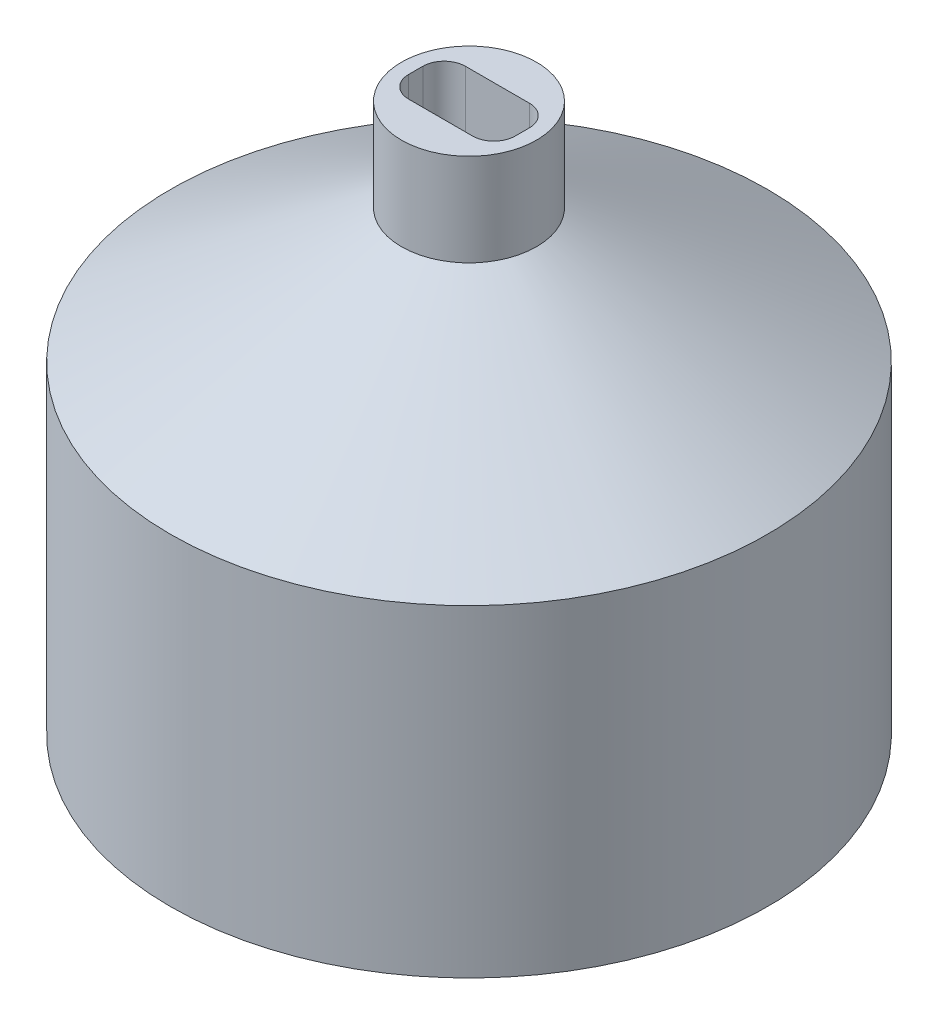
ISO-10303-21;
HEADER;
FILE_DESCRIPTION(('STEP AP214'),'2;1');
FILE_NAME('part.step','',(''),(''),'','','');
FILE_SCHEMA(('AUTOMOTIVE_DESIGN { 1 0 10303 214 1 1 1 1 }'));
ENDSEC;
DATA;
#1=APPLICATION_CONTEXT('core data for automotive mechanical design processes');
#2=APPLICATION_PROTOCOL_DEFINITION('international standard','automotive_design',2000,#1);
#3=PRODUCT_CONTEXT('',#1,'mechanical');
#4=PRODUCT('Part','Part','',(#3));
#5=PRODUCT_RELATED_PRODUCT_CATEGORY('part','',(#4));
#6=PRODUCT_DEFINITION_FORMATION('','',#4);
#7=PRODUCT_DEFINITION_CONTEXT('part definition',#1,'design');
#8=PRODUCT_DEFINITION('design','',#6,#7);
#9=PRODUCT_DEFINITION_SHAPE('','',#8);
#10=(LENGTH_UNIT() NAMED_UNIT(*) SI_UNIT(.MILLI.,.METRE.));
#11=(NAMED_UNIT(*) PLANE_ANGLE_UNIT() SI_UNIT($,.RADIAN.));
#12=(NAMED_UNIT(*) SI_UNIT($,.STERADIAN.) SOLID_ANGLE_UNIT());
#13=UNCERTAINTY_MEASURE_WITH_UNIT(LENGTH_MEASURE(1.E-05),#10,'distance_accuracy_value','');
#14=(GEOMETRIC_REPRESENTATION_CONTEXT(3) GLOBAL_UNCERTAINTY_ASSIGNED_CONTEXT((#13)) GLOBAL_UNIT_ASSIGNED_CONTEXT((#10,
#11,#12)) REPRESENTATION_CONTEXT('',''));
#15=CARTESIAN_POINT('',(0.,0.,0.));
#16=DIRECTION('',(0.,0.,1.));
#17=DIRECTION('',(1.,0.,0.));
#18=AXIS2_PLACEMENT_3D('',#15,#16,#17);
#19=CARTESIAN_POINT('',(0.,3.04641016151377,0.));
#20=DIRECTION('',(0.,-1.,0.));
#21=DIRECTION('',(0.,0.,-1.));
#22=AXIS2_PLACEMENT_3D('',#19,#20,#21);
#23=CONICAL_SURFACE('',#22,4.98371685740844,1.0471975511966);
#24=CARTESIAN_POINT('',(0.,3.04641016151377,0.));
#25=DIRECTION('',(0.,1.,0.));
#26=DIRECTION('',(0.,0.,1.));
#27=AXIS2_PLACEMENT_3D('',#24,#25,#26);
#28=CIRCLE('',#27,4.98371685740844);
#29=CARTESIAN_POINT('',(0.,3.04641016151377,4.98371685740844));
#30=VERTEX_POINT('',#29);
#31=EDGE_CURVE('E190',#30,#30,#28,.T.);
#32=ORIENTED_EDGE('',*,*,#31,.F.);
#33=EDGE_LOOP('',(#32));
#34=FACE_BOUND('',#33,.T.);
#35=CARTESIAN_POINT('',(-1.5,3.40725236660195,-4.09248561513208));
#36=CARTESIAN_POINT('',(-1.5,3.45681365681096,-4.00105307469478));
#37=CARTESIAN_POINT('',(-1.5,3.50622777759553,-3.90954045776532));
#38=CARTESIAN_POINT('',(-1.5,3.60468777635295,-3.72631506184784));
#39=CARTESIAN_POINT('',(-1.5,3.65373364699816,-3.63460227892343));
#40=CARTESIAN_POINT('',(-1.5,3.80028081066284,-3.35896667162896));
#41=CARTESIAN_POINT('',(-1.5,3.89711454550405,-3.17468829565215));
#42=CARTESIAN_POINT('',(-1.5,4.09138426305599,-2.7982648865538));
#43=CARTESIAN_POINT('',(-1.5,4.18872364393438,-2.60606949724058));
#44=CARTESIAN_POINT('',(-1.5,4.33095397019992,-2.31595615828423));
#45=CARTESIAN_POINT('',(-1.5,4.37772735319528,-2.21896346237822));
#46=CARTESIAN_POINT('',(-1.5,4.46956014939681,-2.02417224377235));
#47=CARTESIAN_POINT('',(-1.5,4.51461964685899,-1.92637376097395));
#48=CARTESIAN_POINT('',(-1.5,4.60438461359978,-1.72525836814714));
#49=CARTESIAN_POINT('',(-1.5,4.64898115070767,-1.6218924880906));
#50=CARTESIAN_POINT('',(-1.5,4.73451596061967,-1.41360403284423));
#51=CARTESIAN_POINT('',(-1.5,4.77545317241379,-1.3086810163837));
#52=CARTESIAN_POINT('',(-1.5,4.85158996042933,-1.09788593321407));
#53=CARTESIAN_POINT('',(-1.5,4.88684109122856,-0.992032794673912));
#54=CARTESIAN_POINT('',(-1.5,4.94961560908893,-0.778034214722909));
#55=CARTESIAN_POINT('',(-1.5,4.9771431503034,-0.669890039346949));
#56=CARTESIAN_POINT('',(-1.5,5.01575932094634,-0.478805310092273));
#57=CARTESIAN_POINT('',(-1.5,5.02924040925197,-0.396358013950361));
#58=CARTESIAN_POINT('',(-1.5,5.04881079835382,-0.230593804547215));
#59=CARTESIAN_POINT('',(-1.5,5.05490318814466,-0.147277269392752));
#60=CARTESIAN_POINT('',(-1.5,5.05899618388578,0.0194867329141428));
#61=CARTESIAN_POINT('',(-1.5,5.0570041958867,0.102934010257612));
#62=CARTESIAN_POINT('',(-1.5,5.04518692754269,0.269259069963903));
#63=CARTESIAN_POINT('',(-1.5,5.03536029327373,0.352136751396434));
#64=CARTESIAN_POINT('',(-1.5,4.99646368613497,0.594356523206449));
#65=CARTESIAN_POINT('',(-1.5,4.95798620922881,0.752176607806049));
#66=CARTESIAN_POINT('',(-1.5,4.88836027436955,0.985193727325204));
#67=CARTESIAN_POINT('',(-1.5,4.86311885460038,1.06236256071798));
#68=CARTESIAN_POINT('',(-1.5,4.80959744206808,1.21564636970752));
#69=CARTESIAN_POINT('',(-1.5,4.78131792662259,1.29176150873597));
#70=CARTESIAN_POINT('',(-1.5,4.72192818575268,1.44445365871125));
#71=CARTESIAN_POINT('',(-1.5,4.69077595285868,1.52101404737749));
#72=CARTESIAN_POINT('',(-1.5,4.62665248915713,1.67337211443988));
#73=CARTESIAN_POINT('',(-1.5,4.59368115291815,1.74916974832668));
#74=CARTESIAN_POINT('',(-1.5,4.49278504639777,1.97542798846415));
#75=CARTESIAN_POINT('',(-1.5,4.42279369981421,2.12496370044651));
#76=CARTESIAN_POINT('',(-1.5,4.2756705409007,2.43021847743613));
#77=CARTESIAN_POINT('',(-1.5,4.19835679791953,2.58584869317197));
#78=CARTESIAN_POINT('',(-1.5,4.0412983473303,2.89594709515474));
#79=CARTESIAN_POINT('',(-1.5,3.96155273516771,3.05041482169877));
#80=CARTESIAN_POINT('',(-1.5,3.80325421838808,3.35315159657888));
#81=CARTESIAN_POINT('',(-1.5,3.72475621064408,3.5014494719265));
#82=CARTESIAN_POINT('',(-1.5,3.56670428489042,3.79739004644383));
#83=CARTESIAN_POINT('',(-1.5,3.48715089521058,3.94503302747299));
#84=CARTESIAN_POINT('',(-1.5,3.40725236660198,4.09248561513209));
#85=B_SPLINE_CURVE_WITH_KNOTS('',3,(#35,#36,#37,#38,#39,#40,#41,#42,#43,#44,#45,#46,#47,#48,#49,
#50,#51,#52,#53,#54,#55,#56,#57,#58,#59,#60,#61,#62,#63,#64,#65,#66,#67,#68,#69,#70,#71,#72,#73,
#74,#75,#76,#77,#78,#79,#80,#81,#82,#83,#84),.UNSPECIFIED.,.F.,.F.,(4,2,2,2,2,2,2,2,2,2,2,2,2,2,
2,2,2,2,2,2,2,2,2,2,4),(0.,0.312003550624706,0.624013293310247,1.24851674334181,
1.89478245419964,2.21781550555301,2.54083265575705,2.87851365517179,3.21629224869064,
3.55081137640772,3.88515023569818,4.13549910739524,4.38574327957144,4.63575825631347,
4.88581644811055,5.37145709667408,5.61502443415327,5.85855356038223,6.10649545359645,
6.35445173213301,6.84968637373411,7.37098923761412,7.89248842821192,8.39586004982216,
8.89898853741362),.UNSPECIFIED.);
#86=CARTESIAN_POINT('',(-1.5,5.05007093589799,-0.2));
#87=VERTEX_POINT('',#86);
#88=CARTESIAN_POINT('',(-1.5,5.05007093589799,0.200000000000001));
#89=VERTEX_POINT('',#88);
#90=EDGE_CURVE('E131',#87,#89,#85,.T.);
#91=ORIENTED_EDGE('',*,*,#90,.T.);
#92=CARTESIAN_POINT('',(-1.5,5.05007093589799,0.2));
#93=CARTESIAN_POINT('',(-1.50003456707948,5.04763152312658,0.231890846560779));
#94=CARTESIAN_POINT('',(-1.49745926097453,5.04608225879295,0.263843057733521));
#95=CARTESIAN_POINT('',(-1.48727959824091,5.04476776575592,0.326928714253699));
#96=CARTESIAN_POINT('',(-1.47968231129586,5.04500003397049,0.358063246716631));
#97=CARTESIAN_POINT('',(-1.45964318441525,5.04724606795311,0.418682580347212));
#98=CARTESIAN_POINT('',(-1.44719880493939,5.04926076829665,0.448166507435311));
#99=CARTESIAN_POINT('',(-1.41788012910384,5.05503148628607,0.504650699522035));
#100=CARTESIAN_POINT('',(-1.40100597813592,5.05878744678427,0.531651045996247));
#101=CARTESIAN_POINT('',(-1.36325683621154,5.06799995809336,0.582629898482135));
#102=CARTESIAN_POINT('',(-1.34235730181166,5.07346707699104,0.60658828825566));
#103=CARTESIAN_POINT('',(-1.29730120689909,5.08599617910663,0.650717718245941));
#104=CARTESIAN_POINT('',(-1.27314447339592,5.09305824704605,0.670888557168907));
#105=CARTESIAN_POINT('',(-1.22141719268586,5.10893610299743,0.707674311016119));
#106=CARTESIAN_POINT('',(-1.19375652565358,5.11780478728224,0.724139399299231));
#107=CARTESIAN_POINT('',(-1.13656205941203,5.13699163263948,0.752318774434799));
#108=CARTESIAN_POINT('',(-1.10702690264802,5.14731085095137,0.764029571638947));
#109=CARTESIAN_POINT('',(-1.04794363986985,5.16887811740371,0.78226754344457));
#110=CARTESIAN_POINT('',(-1.01842881245463,5.18008371418754,0.788954560354733));
#111=CARTESIAN_POINT('',(-0.9592014631675,5.20355040049485,0.79782573481913));
#112=CARTESIAN_POINT('',(-0.929489382391253,5.21580959136907,0.800017822347127));
#113=CARTESIAN_POINT('',(-0.9,5.2285386435496,0.8));
#114=B_SPLINE_CURVE_WITH_KNOTS('',3,(#92,#93,#94,#95,#96,#97,#98,#99,#100,#101,#102,#103,#104,
#105,#106,#107,#108,#109,#110,#111,#112,#113),.UNSPECIFIED.,.F.,.F.,(4,2,2,2,2,2,2,2,2,2,4),(0.,
0.095825708326257,0.191516804670934,0.287258104098466,0.382996261545153,0.479337768698963,
0.575684394585799,0.675415945911439,0.775220568389831,0.871696853903101,0.96800278858794),.UNSPECIFIED.);
#115=CARTESIAN_POINT('',(-0.900000000000025,5.22853864354965,0.8));
#116=VERTEX_POINT('',#115);
#117=EDGE_CURVE('E60',#89,#116,#114,.T.);
#118=ORIENTED_EDGE('',*,*,#117,.T.);
#119=CARTESIAN_POINT('',(-5.65701904484735,2.62518172294833,0.8));
#120=CARTESIAN_POINT('',(-5.41583730570028,2.76303208785366,0.8));
#121=CARTESIAN_POINT('',(-5.17459988469034,2.90078597876048,0.8));
#122=CARTESIAN_POINT('',(-4.69188606535358,3.17590175434309,0.8));
#123=CARTESIAN_POINT('',(-4.45040965591886,3.31326361952272,0.8));
#124=CARTESIAN_POINT('',(-3.96698777251563,3.58745425084661,0.8));
#125=CARTESIAN_POINT('',(-3.72504211958772,3.72428270157666,0.8));
#126=CARTESIAN_POINT('',(-3.24057805918848,3.99690546689126,0.8));
#127=CARTESIAN_POINT('',(-2.9980596720969,4.13269981756717,0.8));
#128=CARTESIAN_POINT('',(-2.63305486988386,4.3350655622444,0.8));
#129=CARTESIAN_POINT('',(-2.5109934729264,4.40240233754071,0.8));
#130=CARTESIAN_POINT('',(-2.26643149043317,4.53629348737447,0.8));
#131=CARTESIAN_POINT('',(-2.14393087660767,4.60284781028872,0.8));
#132=CARTESIAN_POINT('',(-1.89825079974313,4.73474392231915,0.8));
#133=CARTESIAN_POINT('',(-1.77507123796355,4.80008552869222,0.8));
#134=CARTESIAN_POINT('',(-1.58948338098456,4.89650766838029,0.8));
#135=CARTESIAN_POINT('',(-1.52748799895941,4.92838151584923,0.8));
#136=CARTESIAN_POINT('',(-1.40312922869414,4.99140169612062,0.8));
#137=CARTESIAN_POINT('',(-1.3407658481273,5.02254804402577,0.8));
#138=CARTESIAN_POINT('',(-1.2147302896837,5.08422965407382,0.8));
#139=CARTESIAN_POINT('',(-1.15105162851695,5.11475174643583,0.8));
#140=CARTESIAN_POINT('',(-1.02300078296059,5.17429722582363,0.8));
#141=CARTESIAN_POINT('',(-0.958628655322949,5.20332073438127,0.8));
#142=CARTESIAN_POINT('',(-0.828777293877074,5.25918267697655,0.8));
#143=CARTESIAN_POINT('',(-0.76329618675146,5.28601684874409,0.8));
#144=CARTESIAN_POINT('',(-0.63103714920628,5.33619242564057,0.8));
#145=CARTESIAN_POINT('',(-0.564259674481767,5.35953503386703,0.8));
#146=CARTESIAN_POINT('',(-0.407534835612841,5.40723391643593,0.8));
#147=CARTESIAN_POINT('',(-0.316912134842828,5.42959536621175,0.8));
#148=CARTESIAN_POINT('',(-0.17944312902965,5.45108011413634,0.8));
#149=CARTESIAN_POINT('',(-0.133558149316256,5.45623534794758,0.8));
#150=CARTESIAN_POINT('',(-0.0415004069850994,5.46201241120368,0.8));
#151=CARTESIAN_POINT('',(0.00467228806991895,5.46263526758067,0.8));
#152=CARTESIAN_POINT('',(0.0968898280474593,5.45926600755496,0.8));
#153=CARTESIAN_POINT('',(0.142934489496648,5.45526907918503,0.8));
#154=CARTESIAN_POINT('',(0.234479924336253,5.44313962998056,0.8));
#155=CARTESIAN_POINT('',(0.27998039995443,5.43500494227111,0.8));
#156=CARTESIAN_POINT('',(0.370703185158556,5.41528828828947,0.8));
#157=CARTESIAN_POINT('',(0.415917754588044,5.40367154900945,0.8));
#158=CARTESIAN_POINT('',(0.483159535027013,5.38429571878052,0.8));
#159=CARTESIAN_POINT('',(0.505476723199564,5.3775120095117,0.8));
#160=CARTESIAN_POINT('',(0.54993321558886,5.36337881151703,0.8));
#161=CARTESIAN_POINT('',(0.572072508034269,5.35602928568616,0.8));
#162=CARTESIAN_POINT('',(0.6435435012613,5.33142930619159,0.8));
#163=CARTESIAN_POINT('',(0.692540396962611,5.3132059428661,0.8));
#164=CARTESIAN_POINT('',(0.789854168978579,5.27501701186561,0.8));
#165=CARTESIAN_POINT('',(0.838170857607375,5.25505097387647,0.8));
#166=CARTESIAN_POINT('',(0.982393346845589,5.19325993773514,0.8));
#167=CARTESIAN_POINT('',(1.07749582645917,5.14956993480962,0.8));
#168=CARTESIAN_POINT('',(1.2666261092654,5.05936333320221,0.8));
#169=CARTESIAN_POINT('',(1.36065044846493,5.01283963614586,0.8));
#170=CARTESIAN_POINT('',(1.54781444855055,4.91815937112571,0.8));
#171=CARTESIAN_POINT('',(1.64095451547426,4.87000360411423,0.8));
#172=CARTESIAN_POINT('',(1.8268692059304,4.7725379384569,0.8));
#173=CARTESIAN_POINT('',(1.91964268888908,4.7232258762239,0.8));
#174=CARTESIAN_POINT('',(2.10481493687462,4.6238777410992,0.8));
#175=CARTESIAN_POINT('',(2.19721365554234,4.57384158193397,0.8));
#176=CARTESIAN_POINT('',(2.47371631233216,4.42314588959215,0.8));
#177=CARTESIAN_POINT('',(2.65741586496224,4.32174557873372,0.8));
#178=CARTESIAN_POINT('',(3.07753365127388,4.08826370272569,0.8));
#179=CARTESIAN_POINT('',(3.31375585546818,3.95583079829893,0.8));
#180=CARTESIAN_POINT('',(3.78580210886176,3.68995536910774,0.8));
#181=CARTESIAN_POINT('',(4.02162586681236,3.55651232805517,0.8));
#182=CARTESIAN_POINT('',(4.49088831147123,3.29024533553898,0.8));
#183=CARTESIAN_POINT('',(4.72432975584616,3.15742623928929,0.8));
#184=CARTESIAN_POINT('',(5.19087174073519,2.89149649888422,0.8));
#185=CARTESIAN_POINT('',(5.42397239936801,2.7583860620153,0.8));
#186=CARTESIAN_POINT('',(5.65701904484735,2.62518172294833,0.8));
#187=B_SPLINE_CURVE_WITH_KNOTS('',3,(#119,#120,#121,#122,#123,#124,#125,#126,#127,#128,#129,
#130,#131,#132,#133,#134,#135,#136,#137,#138,#139,#140,#141,#142,#143,#144,#145,#146,#147,#148,
#149,#150,#151,#152,#153,#154,#155,#156,#157,#158,#159,#160,#161,#162,#163,#164,#165,#166,#167,
#168,#169,#170,#171,#172,#173,#174,#175,#176,#177,#178,#179,#180,#181,#182,#183,#184,#185,#186),
.UNSPECIFIED.,.F.,.F.,(4,2,2,2,2,2,2,2,2,2,2,2,2,2,2,2,2,2,2,2,2,2,2,2,2,2,2,2,2,2,2,2,2,4),(0.,
0.83339272638303,1.66682620086311,2.50069436737161,3.33453329624004,3.75274056242224,
4.17097526719578,4.58927249187859,4.79839660225291,5.00751636740239,5.21934908371779,
5.43116459379392,5.64338309349345,5.85552829919853,6.13446761503748,6.27279212840233,
6.41108529964838,6.5495226469535,6.68803256632068,6.82797458838666,6.89794522020545,
6.96792044446149,7.1246952749767,7.28151254758796,7.59538891526146,7.91008674482288,
8.22463230858253,8.53982268808491,8.85505093573013,9.48452539952971,10.2969595200509,
11.1098414743516,11.9155844820061,12.7208719480453),.UNSPECIFIED.);
#188=CARTESIAN_POINT('',(0.900000000000001,5.22853864354959,0.8));
#189=VERTEX_POINT('',#188);
#190=EDGE_CURVE('E124',#116,#189,#187,.T.);
#191=ORIENTED_EDGE('',*,*,#190,.T.);
#192=CARTESIAN_POINT('',(0.900000000000001,5.22853864354959,0.8));
#193=CARTESIAN_POINT('',(0.933853829448547,5.21392339003737,0.800032926133059));
#194=CARTESIAN_POINT('',(0.968011071744757,5.19992659660789,0.797134587395597));
#195=CARTESIAN_POINT('',(1.03593994554105,5.17334228567298,0.785406719703605));
#196=CARTESIAN_POINT('',(1.06971051181354,5.16075807711114,0.776563590182552));
#197=CARTESIAN_POINT('',(1.135786190435,5.1372125181157,0.752848841382082));
#198=CARTESIAN_POINT('',(1.16808765644365,5.12625506748905,0.737963044928253));
#199=CARTESIAN_POINT('',(1.22993294357317,5.10621463124749,0.702407738845777));
#200=CARTESIAN_POINT('',(1.25948028707638,5.0971292328464,0.681745755853329));
#201=CARTESIAN_POINT('',(1.31314363338755,5.08146068429614,0.636435242513924));
#202=CARTESIAN_POINT('',(1.33747188594309,5.0747653702401,0.612077010793075));
#203=CARTESIAN_POINT('',(1.38178111186917,5.06333188306837,0.559268518721837));
#204=CARTESIAN_POINT('',(1.40176187258872,5.05859380567776,0.530818058319303));
#205=CARTESIAN_POINT('',(1.4356143118211,5.05138884543094,0.472385312216186));
#206=CARTESIAN_POINT('',(1.44976581140638,5.04880946693849,0.442578483423335));
#207=CARTESIAN_POINT('',(1.47300302841857,5.04554249170954,0.380966244407629));
#208=CARTESIAN_POINT('',(1.48209338488369,5.04485316027543,0.349162694236133));
#209=CARTESIAN_POINT('',(1.49233618993689,5.04526866778371,0.297596185288787));
#210=CARTESIAN_POINT('',(1.49521152689763,5.04576186468011,0.278152040006306));
#211=CARTESIAN_POINT('',(1.49904313867353,5.04741725175511,0.23913305513385));
#212=CARTESIAN_POINT('',(1.50000226889507,5.04857844320098,0.219558453682089));
#213=CARTESIAN_POINT('',(1.50000000000048,5.05007093589772,0.200000000000093));
#214=B_SPLINE_CURVE_WITH_KNOTS('',3,(#192,#193,#194,#195,#196,#197,#198,#199,#200,#201,#202,
#203,#204,#205,#206,#207,#208,#209,#210,#211,#212,#213),.UNSPECIFIED.,.F.,.F.,(4,2,2,2,2,2,2,2,
2,2,4),(0.,0.110552400924268,0.221358589673787,0.33242626606043,0.443349885397092,
0.548022111780522,0.652699456896679,0.751504803258772,0.850219435020218,0.909108621698555,
0.967909989901455),.UNSPECIFIED.);
#215=CARTESIAN_POINT('',(1.5,5.05007093589799,0.2));
#216=VERTEX_POINT('',#215);
#217=EDGE_CURVE('E101',#189,#216,#214,.T.);
#218=ORIENTED_EDGE('',*,*,#217,.T.);
#219=CARTESIAN_POINT('',(1.5,3.40725236660195,4.09248561513208));
#220=CARTESIAN_POINT('',(1.5,3.45681365681096,4.00105307469478));
#221=CARTESIAN_POINT('',(1.5,3.50622777759553,3.90954045776532));
#222=CARTESIAN_POINT('',(1.5,3.60468777635295,3.72631506184784));
#223=CARTESIAN_POINT('',(1.5,3.65373364699816,3.63460227892343));
#224=CARTESIAN_POINT('',(1.5,3.80028081066284,3.35896667162896));
#225=CARTESIAN_POINT('',(1.5,3.89711454550405,3.17468829565215));
#226=CARTESIAN_POINT('',(1.5,4.09138426305599,2.7982648865538));
#227=CARTESIAN_POINT('',(1.5,4.18872364393438,2.60606949724058));
#228=CARTESIAN_POINT('',(1.5,4.33095397019992,2.31595615828423));
#229=CARTESIAN_POINT('',(1.5,4.37772735319528,2.21896346237822));
#230=CARTESIAN_POINT('',(1.5,4.46956014939681,2.02417224377235));
#231=CARTESIAN_POINT('',(1.5,4.51461964685899,1.92637376097395));
#232=CARTESIAN_POINT('',(1.5,4.60438461359978,1.72525836814714));
#233=CARTESIAN_POINT('',(1.5,4.64898115070767,1.62189248809059));
#234=CARTESIAN_POINT('',(1.5,4.73451596061967,1.41360403284423));
#235=CARTESIAN_POINT('',(1.5,4.77545317241379,1.3086810163837));
#236=CARTESIAN_POINT('',(1.5,4.85158996042933,1.09788593321407));
#237=CARTESIAN_POINT('',(1.5,4.88684109122856,0.992032794673911));
#238=CARTESIAN_POINT('',(1.5,4.94961560908893,0.778034214722908));
#239=CARTESIAN_POINT('',(1.5,4.9771431503034,0.669890039346948));
#240=CARTESIAN_POINT('',(1.5,5.01575932094634,0.478805310092272));
#241=CARTESIAN_POINT('',(1.5,5.02924040925197,0.39635801395036));
#242=CARTESIAN_POINT('',(1.5,5.04881079835382,0.230593804547213));
#243=CARTESIAN_POINT('',(1.5,5.05490318814466,0.14727726939275));
#244=CARTESIAN_POINT('',(1.5,5.05899618388578,-0.0194867329141448));
#245=CARTESIAN_POINT('',(1.5,5.0570041958867,-0.102934010257613));
#246=CARTESIAN_POINT('',(1.5,5.04518692754269,-0.269259069963904));
#247=CARTESIAN_POINT('',(1.5,5.03536029327373,-0.352136751396435));
#248=CARTESIAN_POINT('',(1.5,4.99646368613497,-0.594356523206451));
#249=CARTESIAN_POINT('',(1.5,4.95798620922881,-0.752176607806051));
#250=CARTESIAN_POINT('',(1.5,4.88836027436954,-0.985193727325206));
#251=CARTESIAN_POINT('',(1.5,4.86311885460038,-1.06236256071799));
#252=CARTESIAN_POINT('',(1.5,4.80959744206808,-1.21564636970752));
#253=CARTESIAN_POINT('',(1.5,4.78131792662259,-1.29176150873598));
#254=CARTESIAN_POINT('',(1.5,4.72192818575268,-1.44445365871125));
#255=CARTESIAN_POINT('',(1.5,4.69077595285868,-1.5210140473775));
#256=CARTESIAN_POINT('',(1.5,4.62665248915713,-1.67337211443989));
#257=CARTESIAN_POINT('',(1.5,4.59368115291815,-1.74916974832669));
#258=CARTESIAN_POINT('',(1.5,4.49278504639777,-1.97542798846416));
#259=CARTESIAN_POINT('',(1.5,4.4227936998142,-2.12496370044652));
#260=CARTESIAN_POINT('',(1.5,4.2756705409007,-2.43021847743614));
#261=CARTESIAN_POINT('',(1.5,4.19835679791952,-2.58584869317197));
#262=CARTESIAN_POINT('',(1.5,4.0412983473303,-2.89594709515475));
#263=CARTESIAN_POINT('',(1.5,3.96155273516771,-3.05041482169877));
#264=CARTESIAN_POINT('',(1.5,3.80325421838808,-3.35315159657888));
#265=CARTESIAN_POINT('',(1.5,3.72475621064407,-3.50144947192651));
#266=CARTESIAN_POINT('',(1.5,3.56670428489042,-3.79739004644384));
#267=CARTESIAN_POINT('',(1.5,3.48715089521058,-3.94503302747299));
#268=CARTESIAN_POINT('',(1.5,3.40725236660198,-4.09248561513209));
#269=B_SPLINE_CURVE_WITH_KNOTS('',3,(#219,#220,#221,#222,#223,#224,#225,#226,#227,#228,#229,
#230,#231,#232,#233,#234,#235,#236,#237,#238,#239,#240,#241,#242,#243,#244,#245,#246,#247,#248,
#249,#250,#251,#252,#253,#254,#255,#256,#257,#258,#259,#260,#261,#262,#263,#264,#265,#266,#267,
#268),.UNSPECIFIED.,.F.,.F.,(4,2,2,2,2,2,2,2,2,2,2,2,2,2,2,2,2,2,2,2,2,2,2,2,4),(0.,
0.312003550624706,0.624013293310247,1.24851674334181,1.89478245419964,2.21781550555301,
2.54083265575705,2.87851365517179,3.21629224869064,3.55081137640772,3.88515023569818,
4.13549910739524,4.38574327957144,4.63575825631347,4.88581644811055,5.37145709667408,
5.61502443415327,5.85855356038223,6.10649545359646,6.35445173213302,6.84968637373412,
7.37098923761412,7.89248842821192,8.39586004982216,8.89898853741362),.UNSPECIFIED.);
#270=CARTESIAN_POINT('',(1.5,5.05007093589799,-0.2));
#271=VERTEX_POINT('',#270);
#272=EDGE_CURVE('E174',#216,#271,#269,.T.);
#273=ORIENTED_EDGE('',*,*,#272,.T.);
#274=CARTESIAN_POINT('',(1.5,5.05007093589799,-0.2));
#275=CARTESIAN_POINT('',(1.50003456707949,5.04763152312658,-0.231890846560779));
#276=CARTESIAN_POINT('',(1.49745926097453,5.04608225879295,-0.263843057733521));
#277=CARTESIAN_POINT('',(1.48727959824091,5.04476776575592,-0.326928714253699));
#278=CARTESIAN_POINT('',(1.47968231129586,5.04500003397049,-0.358063246716631));
#279=CARTESIAN_POINT('',(1.45964318441525,5.04724606795311,-0.418682580347212));
#280=CARTESIAN_POINT('',(1.44719880493939,5.04926076829665,-0.448166507435311));
#281=CARTESIAN_POINT('',(1.41788012910384,5.05503148628607,-0.504650699522035));
#282=CARTESIAN_POINT('',(1.40100597813592,5.05878744678426,-0.531651045996247));
#283=CARTESIAN_POINT('',(1.36325683621154,5.06799995809336,-0.582629898482135));
#284=CARTESIAN_POINT('',(1.34235730181166,5.07346707699104,-0.60658828825566));
#285=CARTESIAN_POINT('',(1.29730120689909,5.08599617910663,-0.650717718245941));
#286=CARTESIAN_POINT('',(1.27314447339592,5.09305824704605,-0.670888557168907));
#287=CARTESIAN_POINT('',(1.22141719268587,5.10893610299743,-0.707674311016118));
#288=CARTESIAN_POINT('',(1.19375652565358,5.11780478728223,-0.724139399299231));
#289=CARTESIAN_POINT('',(1.13656205941203,5.13699163263947,-0.752318774434799));
#290=CARTESIAN_POINT('',(1.10702690264802,5.14731085095137,-0.764029571638946));
#291=CARTESIAN_POINT('',(1.04794363986985,5.16887811740371,-0.78226754344457));
#292=CARTESIAN_POINT('',(1.01842881245463,5.18008371418754,-0.788954560354732));
#293=CARTESIAN_POINT('',(0.959201463167501,5.20355040049485,-0.79782573481913));
#294=CARTESIAN_POINT('',(0.929489382391253,5.21580959136907,-0.800017822347127));
#295=CARTESIAN_POINT('',(0.9,5.22853864354959,-0.8));
#296=B_SPLINE_CURVE_WITH_KNOTS('',3,(#274,#275,#276,#277,#278,#279,#280,#281,#282,#283,#284,
#285,#286,#287,#288,#289,#290,#291,#292,#293,#294,#295),.UNSPECIFIED.,.F.,.F.,(4,2,2,2,2,2,2,2,
2,2,4),(0.,0.095825708326257,0.191516804670934,0.287258104098466,0.382996261545153,
0.479337768698963,0.575684394585799,0.675415945911439,0.775220568389831,0.871696853903101,
0.96800278858794),.UNSPECIFIED.);
#297=CARTESIAN_POINT('',(0.900000000000025,5.22853864354965,-0.8));
#298=VERTEX_POINT('',#297);
#299=EDGE_CURVE('E208',#271,#298,#296,.T.);
#300=ORIENTED_EDGE('',*,*,#299,.T.);
#301=CARTESIAN_POINT('',(5.65701904484735,2.62518172294833,-0.8));
#302=CARTESIAN_POINT('',(5.41583730570028,2.76303208785366,-0.8));
#303=CARTESIAN_POINT('',(5.17459988469034,2.90078597876048,-0.8));
#304=CARTESIAN_POINT('',(4.69188606535358,3.17590175434309,-0.8));
#305=CARTESIAN_POINT('',(4.45040965591886,3.31326361952272,-0.8));
#306=CARTESIAN_POINT('',(3.96698777251563,3.58745425084661,-0.8));
#307=CARTESIAN_POINT('',(3.72504211958771,3.72428270157666,-0.8));
#308=CARTESIAN_POINT('',(3.24057805918847,3.99690546689126,-0.8));
#309=CARTESIAN_POINT('',(2.9980596720969,4.13269981756717,-0.8));
#310=CARTESIAN_POINT('',(2.63305486988386,4.3350655622444,-0.8));
#311=CARTESIAN_POINT('',(2.5109934729264,4.40240233754071,-0.8));
#312=CARTESIAN_POINT('',(2.26643149043317,4.53629348737448,-0.8));
#313=CARTESIAN_POINT('',(2.14393087660767,4.60284781028872,-0.8));
#314=CARTESIAN_POINT('',(1.89825079974313,4.73474392231915,-0.8));
#315=CARTESIAN_POINT('',(1.77507123796355,4.80008552869222,-0.8));
#316=CARTESIAN_POINT('',(1.58948338098456,4.89650766838029,-0.8));
#317=CARTESIAN_POINT('',(1.52748799895941,4.92838151584923,-0.8));
#318=CARTESIAN_POINT('',(1.40312922869414,4.99140169612063,-0.8));
#319=CARTESIAN_POINT('',(1.3407658481273,5.02254804402577,-0.8));
#320=CARTESIAN_POINT('',(1.2147302896837,5.08422965407382,-0.8));
#321=CARTESIAN_POINT('',(1.15105162851695,5.11475174643584,-0.8));
#322=CARTESIAN_POINT('',(1.02300078296059,5.17429722582363,-0.8));
#323=CARTESIAN_POINT('',(0.958628655322949,5.20332073438128,-0.8));
#324=CARTESIAN_POINT('',(0.828777293877073,5.25918267697655,-0.8));
#325=CARTESIAN_POINT('',(0.763296186751459,5.28601684874409,-0.8));
#326=CARTESIAN_POINT('',(0.631037149206279,5.33619242564057,-0.8));
#327=CARTESIAN_POINT('',(0.564259674481767,5.35953503386703,-0.8));
#328=CARTESIAN_POINT('',(0.407534835612841,5.40723391643593,-0.8));
#329=CARTESIAN_POINT('',(0.316912134842828,5.42959536621175,-0.8));
#330=CARTESIAN_POINT('',(0.17944312902965,5.45108011413634,-0.8));
#331=CARTESIAN_POINT('',(0.133558149316257,5.45623534794758,-0.8));
#332=CARTESIAN_POINT('',(0.0415004069850998,5.46201241120368,-0.8));
#333=CARTESIAN_POINT('',(-0.00467228806991866,5.46263526758067,-0.8));
#334=CARTESIAN_POINT('',(-0.0968898280474589,5.45926600755496,-0.8));
#335=CARTESIAN_POINT('',(-0.142934489496647,5.45526907918503,-0.8));
#336=CARTESIAN_POINT('',(-0.234479924336252,5.44313962998056,-0.8));
#337=CARTESIAN_POINT('',(-0.279980399954429,5.43500494227111,-0.8));
#338=CARTESIAN_POINT('',(-0.370703185158556,5.41528828828947,-0.8));
#339=CARTESIAN_POINT('',(-0.415917754588044,5.40367154900945,-0.8));
#340=CARTESIAN_POINT('',(-0.483159535027013,5.38429571878052,-0.8));
#341=CARTESIAN_POINT('',(-0.505476723199564,5.3775120095117,-0.8));
#342=CARTESIAN_POINT('',(-0.549933215588859,5.36337881151703,-0.8));
#343=CARTESIAN_POINT('',(-0.572072508034268,5.35602928568616,-0.8));
#344=CARTESIAN_POINT('',(-0.6435435012613,5.33142930619159,-0.8));
#345=CARTESIAN_POINT('',(-0.69254039696261,5.3132059428661,-0.8));
#346=CARTESIAN_POINT('',(-0.789854168978577,5.27501701186561,-0.8));
#347=CARTESIAN_POINT('',(-0.838170857607373,5.25505097387647,-0.8));
#348=CARTESIAN_POINT('',(-0.982393346845588,5.19325993773514,-0.8));
#349=CARTESIAN_POINT('',(-1.07749582645916,5.14956993480962,-0.8));
#350=CARTESIAN_POINT('',(-1.2666261092654,5.05936333320221,-0.8));
#351=CARTESIAN_POINT('',(-1.36065044846493,5.01283963614586,-0.8));
#352=CARTESIAN_POINT('',(-1.54781444855055,4.91815937112571,-0.8));
#353=CARTESIAN_POINT('',(-1.64095451547425,4.87000360411423,-0.8));
#354=CARTESIAN_POINT('',(-1.82686920593039,4.7725379384569,-0.8));
#355=CARTESIAN_POINT('',(-1.91964268888907,4.7232258762239,-0.8));
#356=CARTESIAN_POINT('',(-2.10481493687462,4.6238777410992,-0.8));
#357=CARTESIAN_POINT('',(-2.19721365554234,4.57384158193397,-0.8));
#358=CARTESIAN_POINT('',(-2.47371631233216,4.42314588959215,-0.8));
#359=CARTESIAN_POINT('',(-2.65741586496224,4.32174557873372,-0.8));
#360=CARTESIAN_POINT('',(-3.07753365127388,4.08826370272569,-0.8));
#361=CARTESIAN_POINT('',(-3.31375585546817,3.95583079829893,-0.8));
#362=CARTESIAN_POINT('',(-3.78580210886176,3.68995536910774,-0.8));
#363=CARTESIAN_POINT('',(-4.02162586681236,3.55651232805517,-0.8));
#364=CARTESIAN_POINT('',(-4.49088831147122,3.29024533553899,-0.8));
#365=CARTESIAN_POINT('',(-4.72432975584616,3.15742623928929,-0.8));
#366=CARTESIAN_POINT('',(-5.19087174073519,2.89149649888422,-0.8));
#367=CARTESIAN_POINT('',(-5.42397239936801,2.7583860620153,-0.8));
#368=CARTESIAN_POINT('',(-5.65701904484734,2.62518172294833,-0.8));
#369=B_SPLINE_CURVE_WITH_KNOTS('',3,(#301,#302,#303,#304,#305,#306,#307,#308,#309,#310,#311,
#312,#313,#314,#315,#316,#317,#318,#319,#320,#321,#322,#323,#324,#325,#326,#327,#328,#329,#330,
#331,#332,#333,#334,#335,#336,#337,#338,#339,#340,#341,#342,#343,#344,#345,#346,#347,#348,#349,
#350,#351,#352,#353,#354,#355,#356,#357,#358,#359,#360,#361,#362,#363,#364,#365,#366,#367,#368),
.UNSPECIFIED.,.F.,.F.,(4,2,2,2,2,2,2,2,2,2,2,2,2,2,2,2,2,2,2,2,2,2,2,2,2,2,2,2,2,2,2,2,2,4),(0.,
0.833392726383031,1.66682620086312,2.50069436737161,3.33453329624005,3.75274056242224,
4.17097526719578,4.58927249187859,4.79839660225291,5.00751636740239,5.21934908371779,
5.43116459379392,5.64338309349345,5.85552829919853,6.13446761503748,6.27279212840233,
6.41108529964838,6.5495226469535,6.68803256632068,6.82797458838666,6.89794522020545,
6.96792044446149,7.1246952749767,7.28151254758796,7.59538891526146,7.91008674482288,
8.22463230858253,8.53982268808491,8.85505093573013,9.4845253995297,10.2969595200509,
11.1098414743516,11.9155844820061,12.7208719480453),.UNSPECIFIED.);
#370=CARTESIAN_POINT('',(-0.9,5.22853864354959,-0.8));
#371=VERTEX_POINT('',#370);
#372=EDGE_CURVE('E133',#298,#371,#369,.T.);
#373=ORIENTED_EDGE('',*,*,#372,.T.);
#374=CARTESIAN_POINT('',(-0.9,5.22853864354959,-0.8));
#375=CARTESIAN_POINT('',(-0.933853829448546,5.21392339003736,-0.800032926133059));
#376=CARTESIAN_POINT('',(-0.968011071744756,5.19992659660789,-0.797134587395597));
#377=CARTESIAN_POINT('',(-1.03593994554105,5.17334228567298,-0.785406719703604));
#378=CARTESIAN_POINT('',(-1.06971051181354,5.16075807711114,-0.776563590182552));
#379=CARTESIAN_POINT('',(-1.135786190435,5.1372125181157,-0.752848841382082));
#380=CARTESIAN_POINT('',(-1.16808765644365,5.12625506748905,-0.737963044928252));
#381=CARTESIAN_POINT('',(-1.22993294357317,5.10621463124749,-0.702407738845776));
#382=CARTESIAN_POINT('',(-1.25948028707638,5.0971292328464,-0.681745755853329));
#383=CARTESIAN_POINT('',(-1.31314363338755,5.08146068429614,-0.636435242513924));
#384=CARTESIAN_POINT('',(-1.33747188594309,5.07476537024011,-0.612077010793074));
#385=CARTESIAN_POINT('',(-1.38178111186916,5.06333188306837,-0.559268518721837));
#386=CARTESIAN_POINT('',(-1.40176187258872,5.05859380567776,-0.530818058319303));
#387=CARTESIAN_POINT('',(-1.4356143118211,5.05138884543094,-0.472385312216185));
#388=CARTESIAN_POINT('',(-1.44976581140638,5.04880946693849,-0.442578483423334));
#389=CARTESIAN_POINT('',(-1.47300302841856,5.04554249170954,-0.380966244407628));
#390=CARTESIAN_POINT('',(-1.48209338488369,5.04485316027543,-0.349162694236133));
#391=CARTESIAN_POINT('',(-1.49233618993689,5.04526866778371,-0.297596185288787));
#392=CARTESIAN_POINT('',(-1.49521152689763,5.04576186468011,-0.278152040006306));
#393=CARTESIAN_POINT('',(-1.49904313867353,5.04741725175511,-0.239133055133849));
#394=CARTESIAN_POINT('',(-1.50000226889507,5.04857844320098,-0.219558453682089));
#395=CARTESIAN_POINT('',(-1.50000000000048,5.05007093589772,-0.200000000000093));
#396=B_SPLINE_CURVE_WITH_KNOTS('',3,(#374,#375,#376,#377,#378,#379,#380,#381,#382,#383,#384,
#385,#386,#387,#388,#389,#390,#391,#392,#393,#394,#395),.UNSPECIFIED.,.F.,.F.,(4,2,2,2,2,2,2,2,
2,2,4),(0.,0.110552400924268,0.221358589673787,0.332426266060431,0.443349885397092,
0.548022111780523,0.65269945689668,0.751504803258772,0.850219435020218,0.909108621698555,
0.967909989901455),.UNSPECIFIED.);
#397=EDGE_CURVE('E51',#371,#87,#396,.T.);
#398=ORIENTED_EDGE('',*,*,#397,.T.);
#399=EDGE_LOOP('',(#91,#118,#191,#218,#273,#300,#373,#398));
#400=FACE_BOUND('',#399,.T.);
#401=ADVANCED_FACE('F41',(#34,#400),#23,.F.);
#402=CARTESIAN_POINT('',(-2.,10.1950417228135,0.));
#403=DIRECTION('',(0.,1.,0.));
#404=DIRECTION('',(0.,0.,1.));
#405=AXIS2_PLACEMENT_3D('',#402,#403,#404);
#406=PLANE('',#405);
#407=CARTESIAN_POINT('',(0.,10.1950417228135,0.));
#408=DIRECTION('',(0.,1.,0.));
#409=DIRECTION('',(0.,0.,1.));
#410=AXIS2_PLACEMENT_3D('',#407,#408,#409);
#411=CIRCLE('',#410,1.9);
#412=CARTESIAN_POINT('',(0.,10.1950417228135,1.9));
#413=VERTEX_POINT('',#412);
#414=EDGE_CURVE('E180',#413,#413,#411,.T.);
#415=ORIENTED_EDGE('',*,*,#414,.T.);
#416=EDGE_LOOP('',(#415));
#417=FACE_BOUND('',#416,.T.);
#418=DIRECTION('',(-1.,0.,0.));
#419=VECTOR('',#418,1.);
#420=CARTESIAN_POINT('',(-1.5,10.1950417228135,-0.8));
#421=LINE('',#420,#419);
#422=CARTESIAN_POINT('',(0.9,10.1950417228135,-0.8));
#423=VERTEX_POINT('',#422);
#424=CARTESIAN_POINT('',(-0.9,10.1950417228135,-0.8));
#425=VERTEX_POINT('',#424);
#426=EDGE_CURVE('E246',#423,#425,#421,.T.);
#427=ORIENTED_EDGE('',*,*,#426,.F.);
#428=CARTESIAN_POINT('',(0.9,10.1950417228135,-0.2));
#429=DIRECTION('',(0.,1.,0.));
#430=DIRECTION('',(0.,0.,1.));
#431=AXIS2_PLACEMENT_3D('',#428,#429,#430);
#432=CIRCLE('',#431,0.6);
#433=CARTESIAN_POINT('',(1.5,10.1950417228135,-0.2));
#434=VERTEX_POINT('',#433);
#435=EDGE_CURVE('E45',#423,#434,#432,.F.);
#436=ORIENTED_EDGE('',*,*,#435,.T.);
#437=DIRECTION('',(0.,0.,-1.));
#438=VECTOR('',#437,1.);
#439=CARTESIAN_POINT('',(1.5,10.1950417228135,0.8));
#440=LINE('',#439,#438);
#441=CARTESIAN_POINT('',(1.5,10.1950417228135,0.2));
#442=VERTEX_POINT('',#441);
#443=EDGE_CURVE('E248',#442,#434,#440,.T.);
#444=ORIENTED_EDGE('',*,*,#443,.F.);
#445=CARTESIAN_POINT('',(0.900000000000001,10.1950417228135,0.2));
#446=DIRECTION('',(0.,1.,0.));
#447=DIRECTION('',(0.,0.,1.));
#448=AXIS2_PLACEMENT_3D('',#445,#446,#447);
#449=CIRCLE('',#448,0.6);
#450=CARTESIAN_POINT('',(0.900000000000001,10.1950417228135,0.8));
#451=VERTEX_POINT('',#450);
#452=EDGE_CURVE('E118',#442,#451,#449,.F.);
#453=ORIENTED_EDGE('',*,*,#452,.T.);
#454=DIRECTION('',(1.,0.,0.));
#455=VECTOR('',#454,1.);
#456=CARTESIAN_POINT('',(-1.5,10.1950417228135,0.8));
#457=LINE('',#456,#455);
#458=CARTESIAN_POINT('',(-0.9,10.1950417228135,0.8));
#459=VERTEX_POINT('',#458);
#460=EDGE_CURVE('E126',#459,#451,#457,.T.);
#461=ORIENTED_EDGE('',*,*,#460,.F.);
#462=CARTESIAN_POINT('',(-0.9,10.1950417228135,0.2));
#463=DIRECTION('',(0.,1.,0.));
#464=DIRECTION('',(0.,0.,1.));
#465=AXIS2_PLACEMENT_3D('',#462,#463,#464);
#466=CIRCLE('',#465,0.6);
#467=CARTESIAN_POINT('',(-1.5,10.1950417228135,0.2));
#468=VERTEX_POINT('',#467);
#469=EDGE_CURVE('E236',#459,#468,#466,.F.);
#470=ORIENTED_EDGE('',*,*,#469,.T.);
#471=DIRECTION('',(0.,0.,1.));
#472=VECTOR('',#471,1.);
#473=CARTESIAN_POINT('',(-1.5,10.1950417228135,0.8));
#474=LINE('',#473,#472);
#475=CARTESIAN_POINT('',(-1.5,10.1950417228135,-0.2));
#476=VERTEX_POINT('',#475);
#477=EDGE_CURVE('E135',#476,#468,#474,.T.);
#478=ORIENTED_EDGE('',*,*,#477,.F.);
#479=CARTESIAN_POINT('',(-0.9,10.1950417228135,-0.2));
#480=DIRECTION('',(0.,1.,0.));
#481=DIRECTION('',(0.,0.,1.));
#482=AXIS2_PLACEMENT_3D('',#479,#480,#481);
#483=CIRCLE('',#482,0.6);
#484=EDGE_CURVE('E12',#476,#425,#483,.F.);
#485=ORIENTED_EDGE('',*,*,#484,.T.);
#486=EDGE_LOOP('',(#427,#436,#444,#453,#461,#470,#478,#485));
#487=FACE_BOUND('',#486,.T.);
#488=ADVANCED_FACE('F43',(#417,#487),#406,.T.);
#489=CARTESIAN_POINT('',(0.,-5.22487113059657,0.));
#490=DIRECTION('',(0.,-1.,0.));
#491=DIRECTION('',(0.,0.,-1.));
#492=AXIS2_PLACEMENT_3D('',#489,#490,#491);
#493=CONICAL_SURFACE('',#492,7.2,0.261799387799143);
#494=ORIENTED_EDGE('',*,*,#31,.T.);
#495=EDGE_LOOP('',(#494));
#496=FACE_BOUND('',#495,.T.);
#497=CARTESIAN_POINT('',(0.,-5.22487113059657,0.));
#498=DIRECTION('',(0.,1.,0.));
#499=DIRECTION('',(0.,0.,1.));
#500=AXIS2_PLACEMENT_3D('',#497,#498,#499);
#501=CIRCLE('',#500,7.2);
#502=CARTESIAN_POINT('',(0.,-5.22487113059657,7.2));
#503=VERTEX_POINT('',#502);
#504=EDGE_CURVE('E187',#503,#503,#501,.T.);
#505=ORIENTED_EDGE('',*,*,#504,.F.);
#506=EDGE_LOOP('',(#505));
#507=FACE_BOUND('',#506,.T.);
#508=ADVANCED_FACE('F265',(#496,#507),#493,.F.);
#509=CARTESIAN_POINT('',(-7.2,-5.22487113059657,0.));
#510=DIRECTION('',(0.,-1.,0.));
#511=DIRECTION('',(0.,0.,-1.));
#512=AXIS2_PLACEMENT_3D('',#509,#510,#511);
#513=PLANE('',#512);
#514=ORIENTED_EDGE('',*,*,#504,.T.);
#515=EDGE_LOOP('',(#514));
#516=FACE_BOUND('',#515,.T.);
#517=CARTESIAN_POINT('',(0.,-5.22487113059657,0.));
#518=DIRECTION('',(0.,1.,0.));
#519=DIRECTION('',(0.,0.,1.));
#520=AXIS2_PLACEMENT_3D('',#517,#518,#519);
#521=CIRCLE('',#520,8.4);
#522=CARTESIAN_POINT('',(0.,-5.22487113059657,8.4));
#523=VERTEX_POINT('',#522);
#524=EDGE_CURVE('E184',#523,#523,#521,.T.);
#525=ORIENTED_EDGE('',*,*,#524,.F.);
#526=EDGE_LOOP('',(#525));
#527=FACE_BOUND('',#526,.T.);
#528=ADVANCED_FACE('F271',(#516,#527),#513,.T.);
#529=CARTESIAN_POINT('',(0.,55.,0.));
#530=DIRECTION('',(0.,1.,0.));
#531=DIRECTION('',(0.,0.,1.));
#532=AXIS2_PLACEMENT_3D('',#529,#530,#531);
#533=CYLINDRICAL_SURFACE('',#532,8.4);
#534=ORIENTED_EDGE('',*,*,#524,.T.);
#535=EDGE_LOOP('',(#534));
#536=FACE_BOUND('',#535,.T.);
#537=CARTESIAN_POINT('',(0.,3.84529946162077,0.));
#538=DIRECTION('',(0.,1.,0.));
#539=DIRECTION('',(0.,0.,1.));
#540=AXIS2_PLACEMENT_3D('',#537,#538,#539);
#541=CIRCLE('',#540,8.4);
#542=CARTESIAN_POINT('',(0.,3.84529946162077,-8.4));
#543=VERTEX_POINT('',#542);
#544=EDGE_CURVE('E181',#543,#543,#541,.T.);
#545=ORIENTED_EDGE('',*,*,#544,.F.);
#546=EDGE_LOOP('',(#545));
#547=FACE_BOUND('',#546,.T.);
#548=ADVANCED_FACE('F284',(#536,#547),#533,.T.);
#549=CARTESIAN_POINT('',(0.,8.69504172281359,0.));
#550=DIRECTION('',(0.,-1.,0.));
#551=DIRECTION('',(0.,0.,-1.));
#552=AXIS2_PLACEMENT_3D('',#549,#550,#551);
#553=CONICAL_SURFACE('',#552,0.,1.0471975511966);
#554=CARTESIAN_POINT('',(0.,7.59807621135331,0.));
#555=DIRECTION('',(0.,-1.,0.));
#556=DIRECTION('',(0.,0.,-1.));
#557=AXIS2_PLACEMENT_3D('',#554,#555,#556);
#558=CIRCLE('',#557,1.9);
#559=CARTESIAN_POINT('',(0.,7.59807621135331,-1.9));
#560=VERTEX_POINT('',#559);
#561=EDGE_CURVE('E193',#560,#560,#558,.F.);
#562=CARTESIAN_POINT('',(0.,7.59807621135331,-1.9));
#563=CARTESIAN_POINT('',(0.,7.55898478687693,-1.96770833333333));
#564=CARTESIAN_POINT('',(0.,7.51989336240055,-2.03541666666667));
#565=CARTESIAN_POINT('',(0.,7.44171051344779,-2.17083333333333));
#566=CARTESIAN_POINT('',(0.,7.40261908897141,-2.23854166666667));
#567=CARTESIAN_POINT('',(0.,7.32443624001865,-2.37395833333333));
#568=CARTESIAN_POINT('',(0.,7.28534481554227,-2.44166666666667));
#569=CARTESIAN_POINT('',(0.,7.20716196658951,-2.57708333333333));
#570=CARTESIAN_POINT('',(0.,7.16807054211313,-2.64479166666667));
#571=CARTESIAN_POINT('',(0.,7.08988769316036,-2.78020833333333));
#572=CARTESIAN_POINT('',(0.,7.05079626868398,-2.84791666666667));
#573=CARTESIAN_POINT('',(0.,6.97261341973122,-2.98333333333333));
#574=CARTESIAN_POINT('',(0.,6.93352199525484,-3.05104166666667));
#575=CARTESIAN_POINT('',(0.,6.85533914630208,-3.18645833333333));
#576=CARTESIAN_POINT('',(0.,6.8162477218257,-3.25416666666667));
#577=CARTESIAN_POINT('',(0.,6.73806487287294,-3.38958333333333));
#578=CARTESIAN_POINT('',(0.,6.69897344839656,-3.45729166666667));
#579=CARTESIAN_POINT('',(0.,6.6207905994438,-3.59270833333333));
#580=CARTESIAN_POINT('',(0.,6.58169917496742,-3.66041666666667));
#581=CARTESIAN_POINT('',(0.,6.50351632601465,-3.79583333333333));
#582=CARTESIAN_POINT('',(0.,6.46442490153827,-3.86354166666667));
#583=CARTESIAN_POINT('',(0.,6.38624205258551,-3.99895833333333));
#584=CARTESIAN_POINT('',(0.,6.34715062810913,-4.06666666666667));
#585=CARTESIAN_POINT('',(0.,6.26896777915637,-4.20208333333333));
#586=CARTESIAN_POINT('',(0.,6.22987635467999,-4.26979166666667));
#587=CARTESIAN_POINT('',(0.,6.15169350572723,-4.40520833333333));
#588=CARTESIAN_POINT('',(0.,6.11260208125085,-4.47291666666666));
#589=CARTESIAN_POINT('',(0.,6.03441923229809,-4.60833333333333));
#590=CARTESIAN_POINT('',(0.,5.9953278078217,-4.67604166666667));
#591=CARTESIAN_POINT('',(0.,5.91714495886894,-4.81145833333333));
#592=CARTESIAN_POINT('',(0.,5.87805353439256,-4.87916666666667));
#593=CARTESIAN_POINT('',(0.,5.7998706854398,-5.01458333333333));
#594=CARTESIAN_POINT('',(0.,5.76077926096342,-5.08229166666667));
#595=CARTESIAN_POINT('',(0.,5.68259641201066,-5.21770833333333));
#596=CARTESIAN_POINT('',(0.,5.64350498753428,-5.28541666666666));
#597=CARTESIAN_POINT('',(0.,5.56532213858152,-5.42083333333333));
#598=CARTESIAN_POINT('',(0.,5.52623071410514,-5.48854166666666));
#599=CARTESIAN_POINT('',(0.,5.44804786515237,-5.62395833333333));
#600=CARTESIAN_POINT('',(0.,5.40895644067599,-5.69166666666667));
#601=CARTESIAN_POINT('',(0.,5.33077359172323,-5.82708333333333));
#602=CARTESIAN_POINT('',(0.,5.29168216724685,-5.89479166666667));
#603=CARTESIAN_POINT('',(0.,5.21349931829409,-6.03020833333333));
#604=CARTESIAN_POINT('',(0.,5.17440789381771,-6.09791666666667));
#605=CARTESIAN_POINT('',(0.,5.09622504486495,-6.23333333333333));
#606=CARTESIAN_POINT('',(0.,5.05713362038857,-6.30104166666666));
#607=CARTESIAN_POINT('',(0.,4.97895077143581,-6.43645833333333));
#608=CARTESIAN_POINT('',(0.,4.93985934695943,-6.50416666666666));
#609=CARTESIAN_POINT('',(0.,4.86167649800666,-6.63958333333333));
#610=CARTESIAN_POINT('',(0.,4.82258507353028,-6.70729166666667));
#611=CARTESIAN_POINT('',(0.,4.74440222457752,-6.84270833333333));
#612=CARTESIAN_POINT('',(0.,4.70531080010114,-6.91041666666667));
#613=CARTESIAN_POINT('',(0.,4.62712795114838,-7.04583333333333));
#614=CARTESIAN_POINT('',(0.,4.588036526672,-7.11354166666667));
#615=CARTESIAN_POINT('',(0.,4.50985367771924,-7.24895833333333));
#616=CARTESIAN_POINT('',(0.,4.47076225324286,-7.31666666666667));
#617=CARTESIAN_POINT('',(0.,4.3925794042901,-7.45208333333333));
#618=CARTESIAN_POINT('',(0.,4.35348797981371,-7.51979166666667));
#619=CARTESIAN_POINT('',(0.,4.27530513086095,-7.65520833333333));
#620=CARTESIAN_POINT('',(0.,4.23621370638457,-7.72291666666667));
#621=CARTESIAN_POINT('',(0.,4.15803085743181,-7.85833333333333));
#622=CARTESIAN_POINT('',(0.,4.11893943295543,-7.92604166666667));
#623=CARTESIAN_POINT('',(0.,4.04075658400267,-8.06145833333333));
#624=CARTESIAN_POINT('',(0.,4.00166515952629,-8.12916666666666));
#625=CARTESIAN_POINT('',(0.,3.92348231057353,-8.26458333333333));
#626=CARTESIAN_POINT('',(0.,3.88439088609715,-8.33229166666666));
#627=CARTESIAN_POINT('',(0.,3.84529946162077,-8.4));
#628=B_SPLINE_CURVE_WITH_KNOTS('',3,(#562,#563,#564,#565,#566,#567,#568,#569,#570,#571,#572,
#573,#574,#575,#576,#577,#578,#579,#580,#581,#582,#583,#584,#585,#586,#587,#588,#589,#590,#591,
#592,#593,#594,#595,#596,#597,#598,#599,#600,#601,#602,#603,#604,#605,#606,#607,#608,#609,#610,
#611,#612,#613,#614,#615,#616,#617,#618,#619,#620,#621,#622,#623,#624,#625,#626,#627),
.UNSPECIFIED.,.F.,.F.,(4,2,2,2,2,2,2,2,2,2,2,2,2,2,2,2,2,2,2,2,2,2,2,2,2,2,2,2,2,2,2,2,4),(0.,
0.234548546858286,0.469097093716571,0.703645640574856,0.938194187433141,1.17274273429143,
1.40729128114971,1.641839828008,1.87638837486628,2.11093692172457,2.34548546858285,
2.58003401544114,2.81458256229942,3.04913110915771,3.28367965601599,3.51822820287428,
3.75277674973256,3.98732529659085,4.22187384344913,4.45642239030742,4.6909709371657,
4.92551948402399,5.16006803088227,5.39461657774056,5.62916512459885,5.86371367145713,
6.09826221831541,6.3328107651737,6.56735931203199,6.80190785889027,7.03645640574856,
7.27100495260684,7.50555349946512),.UNSPECIFIED.);
#629=EDGE_CURVE('BSEAM278',#560,#543,#628,.T.);
#630=ORIENTED_EDGE('',*,*,#561,.F.);
#631=ORIENTED_EDGE('',*,*,#544,.T.);
#632=ORIENTED_EDGE('',*,*,#629,.T.);
#633=ORIENTED_EDGE('',*,*,#629,.F.);
#634=EDGE_LOOP('',(#630,#632,#631,#633));
#635=FACE_BOUND('',#634,.T.);
#636=ADVANCED_FACE('F278',(#635),#553,.T.);
#637=CARTESIAN_POINT('',(0.,55.,0.));
#638=DIRECTION('',(0.,1.,0.));
#639=DIRECTION('',(0.,0.,1.));
#640=AXIS2_PLACEMENT_3D('',#637,#638,#639);
#641=CYLINDRICAL_SURFACE('',#640,1.9);
#642=ORIENTED_EDGE('',*,*,#561,.T.);
#643=EDGE_LOOP('',(#642));
#644=FACE_BOUND('',#643,.T.);
#645=ORIENTED_EDGE('',*,*,#414,.F.);
#646=EDGE_LOOP('',(#645));
#647=FACE_BOUND('',#646,.T.);
#648=ADVANCED_FACE('F276',(#644,#647),#641,.T.);
#649=CARTESIAN_POINT('',(1.5,10.2950417228136,0.8));
#650=DIRECTION('',(-1.,0.,0.));
#651=DIRECTION('',(0.,0.,1.));
#652=AXIS2_PLACEMENT_3D('',#649,#650,#651);
#653=PLANE('',#652);
#654=ORIENTED_EDGE('',*,*,#443,.T.);
#655=DIRECTION('',(0.,-1.,0.));
#656=VECTOR('',#655,1.);
#657=CARTESIAN_POINT('',(1.5,4.94226497308104,-0.2));
#658=LINE('',#657,#656);
#659=EDGE_CURVE('E195',#434,#271,#658,.T.);
#660=ORIENTED_EDGE('',*,*,#659,.T.);
#661=ORIENTED_EDGE('',*,*,#272,.F.);
#662=DIRECTION('',(0.,-1.,0.));
#663=VECTOR('',#662,1.);
#664=CARTESIAN_POINT('',(1.5,10.2950417228136,0.2));
#665=LINE('',#664,#663);
#666=EDGE_CURVE('E117',#216,#442,#665,.F.);
#667=ORIENTED_EDGE('',*,*,#666,.T.);
#668=EDGE_LOOP('',(#654,#660,#661,#667));
#669=FACE_BOUND('',#668,.T.);
#670=ADVANCED_FACE('F164',(#669),#653,.T.);
#671=CARTESIAN_POINT('',(-1.5,10.2950417228136,-0.8));
#672=DIRECTION('',(0.,0.,1.));
#673=DIRECTION('',(1.,0.,0.));
#674=AXIS2_PLACEMENT_3D('',#671,#672,#673);
#675=PLANE('',#674);
#676=ORIENTED_EDGE('',*,*,#372,.F.);
#677=DIRECTION('',(0.,-1.,0.));
#678=VECTOR('',#677,1.);
#679=CARTESIAN_POINT('',(0.9,10.2950417228136,-0.8));
#680=LINE('',#679,#678);
#681=EDGE_CURVE('E201',#298,#423,#680,.F.);
#682=ORIENTED_EDGE('',*,*,#681,.T.);
#683=ORIENTED_EDGE('',*,*,#426,.T.);
#684=DIRECTION('',(0.,-1.,0.));
#685=VECTOR('',#684,1.);
#686=CARTESIAN_POINT('',(-0.9,4.94226497308104,-0.8));
#687=LINE('',#686,#685);
#688=EDGE_CURVE('E198',#425,#371,#687,.T.);
#689=ORIENTED_EDGE('',*,*,#688,.T.);
#690=EDGE_LOOP('',(#676,#682,#683,#689));
#691=FACE_BOUND('',#690,.T.);
#692=ADVANCED_FACE('F159',(#691),#675,.T.);
#693=CARTESIAN_POINT('',(-1.5,10.2950417228136,0.8));
#694=DIRECTION('',(1.,0.,0.));
#695=DIRECTION('',(0.,0.,-1.));
#696=AXIS2_PLACEMENT_3D('',#693,#694,#695);
#697=PLANE('',#696);
#698=ORIENTED_EDGE('',*,*,#477,.T.);
#699=DIRECTION('',(0.,-1.,0.));
#700=VECTOR('',#699,1.);
#701=CARTESIAN_POINT('',(-1.5,4.94226497308104,0.2));
#702=LINE('',#701,#700);
#703=EDGE_CURVE('E206',#468,#89,#702,.T.);
#704=ORIENTED_EDGE('',*,*,#703,.T.);
#705=ORIENTED_EDGE('',*,*,#90,.F.);
#706=DIRECTION('',(0.,-1.,0.));
#707=VECTOR('',#706,1.);
#708=CARTESIAN_POINT('',(-1.5,10.2950417228136,-0.2));
#709=LINE('',#708,#707);
#710=EDGE_CURVE('E127',#87,#476,#709,.F.);
#711=ORIENTED_EDGE('',*,*,#710,.T.);
#712=EDGE_LOOP('',(#698,#704,#705,#711));
#713=FACE_BOUND('',#712,.T.);
#714=ADVANCED_FACE('F155',(#713),#697,.T.);
#715=CARTESIAN_POINT('',(-1.5,10.2950417228136,0.8));
#716=DIRECTION('',(0.,0.,-1.));
#717=DIRECTION('',(-1.,0.,0.));
#718=AXIS2_PLACEMENT_3D('',#715,#716,#717);
#719=PLANE('',#718);
#720=ORIENTED_EDGE('',*,*,#460,.T.);
#721=DIRECTION('',(0.,-1.,0.));
#722=VECTOR('',#721,1.);
#723=CARTESIAN_POINT('',(0.900000000000001,4.94226497308104,0.8));
#724=LINE('',#723,#722);
#725=EDGE_CURVE('E116',#451,#189,#724,.T.);
#726=ORIENTED_EDGE('',*,*,#725,.T.);
#727=ORIENTED_EDGE('',*,*,#190,.F.);
#728=DIRECTION('',(0.,-1.,0.));
#729=VECTOR('',#728,1.);
#730=CARTESIAN_POINT('',(-0.9,10.2950417228135,0.8));
#731=LINE('',#730,#729);
#732=EDGE_CURVE('E128',#116,#459,#731,.F.);
#733=ORIENTED_EDGE('',*,*,#732,.T.);
#734=EDGE_LOOP('',(#720,#726,#727,#733));
#735=FACE_BOUND('',#734,.T.);
#736=ADVANCED_FACE('F123',(#735),#719,.T.);
#737=CARTESIAN_POINT('',(0.9,10.2950417228136,-0.2));
#738=DIRECTION('',(0.,1.,0.));
#739=DIRECTION('',(0.,0.,1.));
#740=AXIS2_PLACEMENT_3D('',#737,#738,#739);
#741=CYLINDRICAL_SURFACE('',#740,0.6);
#742=ORIENTED_EDGE('',*,*,#435,.F.);
#743=ORIENTED_EDGE('',*,*,#681,.F.);
#744=ORIENTED_EDGE('',*,*,#299,.F.);
#745=ORIENTED_EDGE('',*,*,#659,.F.);
#746=EDGE_LOOP('',(#742,#743,#744,#745));
#747=FACE_BOUND('',#746,.T.);
#748=ADVANCED_FACE('F154',(#747),#741,.F.);
#749=CARTESIAN_POINT('',(0.900000000000001,10.2950417228136,0.2));
#750=DIRECTION('',(0.,1.,0.));
#751=DIRECTION('',(0.,0.,1.));
#752=AXIS2_PLACEMENT_3D('',#749,#750,#751);
#753=CYLINDRICAL_SURFACE('',#752,0.6);
#754=ORIENTED_EDGE('',*,*,#452,.F.);
#755=ORIENTED_EDGE('',*,*,#666,.F.);
#756=ORIENTED_EDGE('',*,*,#217,.F.);
#757=ORIENTED_EDGE('',*,*,#725,.F.);
#758=EDGE_LOOP('',(#754,#755,#756,#757));
#759=FACE_BOUND('',#758,.T.);
#760=ADVANCED_FACE('F115',(#759),#753,.F.);
#761=CARTESIAN_POINT('',(-0.9,10.2950417228136,0.2));
#762=DIRECTION('',(0.,1.,0.));
#763=DIRECTION('',(0.,0.,1.));
#764=AXIS2_PLACEMENT_3D('',#761,#762,#763);
#765=CYLINDRICAL_SURFACE('',#764,0.6);
#766=ORIENTED_EDGE('',*,*,#469,.F.);
#767=ORIENTED_EDGE('',*,*,#732,.F.);
#768=ORIENTED_EDGE('',*,*,#117,.F.);
#769=ORIENTED_EDGE('',*,*,#703,.F.);
#770=EDGE_LOOP('',(#766,#767,#768,#769));
#771=FACE_BOUND('',#770,.T.);
#772=ADVANCED_FACE('F225',(#771),#765,.F.);
#773=CARTESIAN_POINT('',(-0.9,10.2950417228136,-0.2));
#774=DIRECTION('',(0.,1.,0.));
#775=DIRECTION('',(0.,0.,1.));
#776=AXIS2_PLACEMENT_3D('',#773,#774,#775);
#777=CYLINDRICAL_SURFACE('',#776,0.6);
#778=ORIENTED_EDGE('',*,*,#484,.F.);
#779=ORIENTED_EDGE('',*,*,#710,.F.);
#780=ORIENTED_EDGE('',*,*,#397,.F.);
#781=ORIENTED_EDGE('',*,*,#688,.F.);
#782=EDGE_LOOP('',(#778,#779,#780,#781));
#783=FACE_BOUND('',#782,.T.);
#784=ADVANCED_FACE('F229',(#783),#777,.F.);
#785=CLOSED_SHELL('',(#401,#488,#508,#528,#548,#636,#648,#670,#692,#714,#736,#748,#760,#772,#784));
#786=MANIFOLD_SOLID_BREP('B2',#785);
#787=ADVANCED_BREP_SHAPE_REPRESENTATION('',(#18,#786),#14);
#788=SHAPE_DEFINITION_REPRESENTATION(#9,#787);
ENDSEC;
END-ISO-10303-21;
